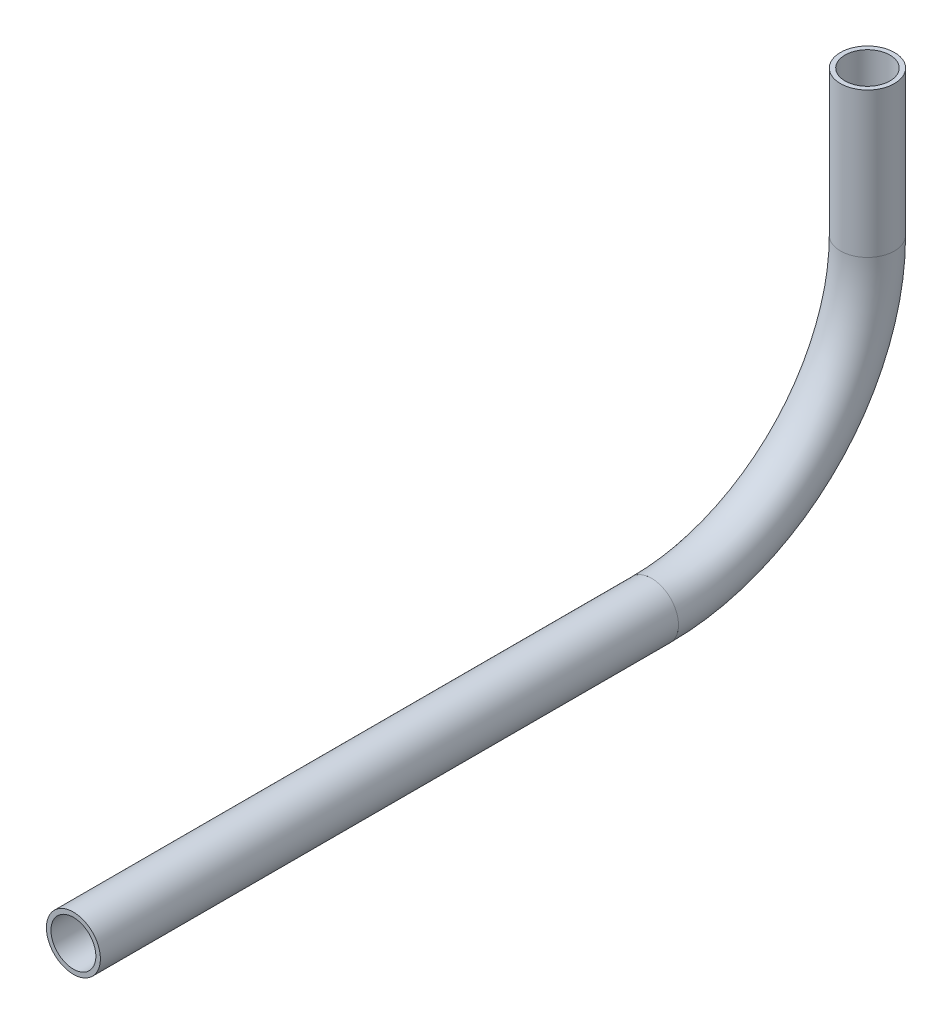
ISO-10303-21;
HEADER;
FILE_DESCRIPTION(('STEP AP214'),'2;1');
FILE_NAME('part.step','',(''),(''),'','','');
FILE_SCHEMA(('AUTOMOTIVE_DESIGN { 1 0 10303 214 1 1 1 1 }'));
ENDSEC;
DATA;
#1=APPLICATION_CONTEXT('core data for automotive mechanical design processes');
#2=APPLICATION_PROTOCOL_DEFINITION('international standard','automotive_design',2000,#1);
#3=PRODUCT_CONTEXT('',#1,'mechanical');
#4=PRODUCT('Part','Part','',(#3));
#5=PRODUCT_RELATED_PRODUCT_CATEGORY('part','',(#4));
#6=PRODUCT_DEFINITION_FORMATION('','',#4);
#7=PRODUCT_DEFINITION_CONTEXT('part definition',#1,'design');
#8=PRODUCT_DEFINITION('design','',#6,#7);
#9=PRODUCT_DEFINITION_SHAPE('','',#8);
#10=(LENGTH_UNIT() NAMED_UNIT(*) SI_UNIT(.MILLI.,.METRE.));
#11=(NAMED_UNIT(*) PLANE_ANGLE_UNIT() SI_UNIT($,.RADIAN.));
#12=(NAMED_UNIT(*) SI_UNIT($,.STERADIAN.) SOLID_ANGLE_UNIT());
#13=UNCERTAINTY_MEASURE_WITH_UNIT(LENGTH_MEASURE(1.E-05),#10,'distance_accuracy_value','');
#14=(GEOMETRIC_REPRESENTATION_CONTEXT(3) GLOBAL_UNCERTAINTY_ASSIGNED_CONTEXT((#13)) GLOBAL_UNIT_ASSIGNED_CONTEXT((#10,
#11,#12)) REPRESENTATION_CONTEXT('',''));
#15=CARTESIAN_POINT('',(0.,0.,0.));
#16=DIRECTION('',(0.,0.,1.));
#17=DIRECTION('',(1.,0.,0.));
#18=AXIS2_PLACEMENT_3D('',#15,#16,#17);
#19=CARTESIAN_POINT('',(0.,599.96001927236,167.15895807332));
#20=DIRECTION('',(0.,0.,1.));
#21=DIRECTION('',(1.,0.,0.));
#22=AXIS2_PLACEMENT_3D('',#19,#20,#21);
#23=CYLINDRICAL_SURFACE('',#22,5.28320000000004);
#24=CARTESIAN_POINT('',(0.,599.96001927236,303.16459571102));
#25=DIRECTION('',(0.,0.,-1.));
#26=DIRECTION('',(-1.,0.,0.));
#27=AXIS2_PLACEMENT_3D('',#24,#25,#26);
#28=CIRCLE('',#27,5.28320000000004);
#29=CARTESIAN_POINT('',(-5.28320000000004,599.96001927236,303.16459571102));
#30=VERTEX_POINT('',#29);
#31=EDGE_CURVE('E54',#30,#30,#28,.T.);
#32=ORIENTED_EDGE('',*,*,#31,.F.);
#33=EDGE_LOOP('',(#32));
#34=FACE_BOUND('',#33,.T.);
#35=CARTESIAN_POINT('',(0.,599.96001927236,167.15895807332));
#36=DIRECTION('',(0.,0.,-1.));
#37=DIRECTION('',(-1.,0.,0.));
#38=AXIS2_PLACEMENT_3D('',#35,#36,#37);
#39=CIRCLE('',#38,5.28320000000004);
#40=CARTESIAN_POINT('',(-5.28320000000004,599.96001927236,167.15895807332));
#41=VERTEX_POINT('',#40);
#42=EDGE_CURVE('E50',#41,#41,#39,.T.);
#43=ORIENTED_EDGE('',*,*,#42,.T.);
#44=EDGE_LOOP('',(#43));
#45=FACE_BOUND('',#44,.T.);
#46=ADVANCED_FACE('F46',(#34,#45),#23,.F.);
#47=CARTESIAN_POINT('',(0.,599.96001927236,167.15895807332));
#48=DIRECTION('',(0.,0.,1.));
#49=DIRECTION('',(1.,0.,0.));
#50=AXIS2_PLACEMENT_3D('',#47,#48,#49);
#51=CYLINDRICAL_SURFACE('',#50,6.35000000000005);
#52=CARTESIAN_POINT('',(0.,599.96001927236,303.16459571102));
#53=DIRECTION('',(0.,0.,-1.));
#54=DIRECTION('',(-1.,0.,0.));
#55=AXIS2_PLACEMENT_3D('',#52,#53,#54);
#56=CIRCLE('',#55,6.35000000000005);
#57=CARTESIAN_POINT('',(-6.35000000000005,599.96001927236,303.16459571102));
#58=VERTEX_POINT('',#57);
#59=EDGE_CURVE('E58',#58,#58,#56,.T.);
#60=ORIENTED_EDGE('',*,*,#59,.T.);
#61=EDGE_LOOP('',(#60));
#62=FACE_BOUND('',#61,.T.);
#63=CARTESIAN_POINT('',(0.,599.96001927236,167.15895807332));
#64=DIRECTION('',(0.,0.,-1.));
#65=DIRECTION('',(-1.,0.,0.));
#66=AXIS2_PLACEMENT_3D('',#63,#64,#65);
#67=CIRCLE('',#66,6.35000000000005);
#68=CARTESIAN_POINT('',(-6.35000000000005,599.96001927236,167.15895807332));
#69=VERTEX_POINT('',#68);
#70=EDGE_CURVE('E12',#69,#69,#67,.T.);
#71=ORIENTED_EDGE('',*,*,#70,.F.);
#72=EDGE_LOOP('',(#71));
#73=FACE_BOUND('',#72,.T.);
#74=ADVANCED_FACE('F73',(#62,#73),#51,.T.);
#75=CARTESIAN_POINT('',(0.,599.96001927236,303.16459571102));
#76=DIRECTION('',(0.,0.,-1.));
#77=DIRECTION('',(-1.,0.,0.));
#78=AXIS2_PLACEMENT_3D('',#75,#76,#77);
#79=PLANE('',#78);
#80=ORIENTED_EDGE('',*,*,#31,.T.);
#81=EDGE_LOOP('',(#80));
#82=FACE_BOUND('',#81,.T.);
#83=ORIENTED_EDGE('',*,*,#59,.F.);
#84=EDGE_LOOP('',(#83));
#85=FACE_BOUND('',#84,.T.);
#86=ADVANCED_FACE('F69',(#82,#85),#79,.F.);
#87=CARTESIAN_POINT('',(0.,599.96001927236,167.15895807332));
#88=DIRECTION('',(0.,0.,-1.));
#89=DIRECTION('',(-1.,0.,0.));
#90=AXIS2_PLACEMENT_3D('',#87,#88,#89);
#91=PLANE('',#90);
#92=ORIENTED_EDGE('',*,*,#42,.F.);
#93=EDGE_LOOP('',(#92));
#94=FACE_BOUND('',#93,.T.);
#95=ORIENTED_EDGE('',*,*,#70,.T.);
#96=EDGE_LOOP('',(#95));
#97=FACE_BOUND('',#96,.T.);
#98=ADVANCED_FACE('F48',(#94,#97),#91,.T.);
#99=CLOSED_SHELL('',(#46,#74,#86,#98));
#100=MANIFOLD_SOLID_BREP('B2',#99);
#101=CARTESIAN_POINT('',(0.,650.76001927236,167.15895807332));
#102=DIRECTION('',(-1.,0.,0.));
#103=DIRECTION('',(0.,0.,1.));
#104=AXIS2_PLACEMENT_3D('',#101,#102,#103);
#105=TOROIDAL_SURFACE('',#104,50.8,5.28320000000004);
#106=CARTESIAN_POINT('',(0.,650.76001927236,116.35895807332));
#107=DIRECTION('',(0.,1.,0.));
#108=DIRECTION('',(0.,0.,1.));
#109=AXIS2_PLACEMENT_3D('',#106,#107,#108);
#110=CIRCLE('',#109,5.28320000000004);
#111=CARTESIAN_POINT('',(0.,650.76001927236,111.07575807332));
#112=VERTEX_POINT('',#111);
#113=EDGE_CURVE('E149',#112,#112,#110,.T.);
#114=CARTESIAN_POINT('',(0.,599.96001927236,167.15895807332));
#115=DIRECTION('',(0.,0.,1.));
#116=DIRECTION('',(1.,0.,0.));
#117=AXIS2_PLACEMENT_3D('',#114,#115,#116);
#118=CIRCLE('',#117,5.28320000000004);
#119=CARTESIAN_POINT('',(0.,594.67681927236,167.15895807332));
#120=VERTEX_POINT('',#119);
#121=EDGE_CURVE('E139',#120,#120,#118,.T.);
#122=CARTESIAN_POINT('',(0.,650.76001927236,167.15895807332));
#123=DIRECTION('',(-1.,0.,0.));
#124=DIRECTION('',(0.,0.,1.));
#125=AXIS2_PLACEMENT_3D('',#122,#123,#124);
#126=CIRCLE('',#125,56.0832000000001);
#127=EDGE_CURVE('',#112,#120,#126,.T.);
#128=ORIENTED_EDGE('',*,*,#113,.T.);
#129=ORIENTED_EDGE('',*,*,#121,.T.);
#130=ORIENTED_EDGE('',*,*,#127,.T.);
#131=ORIENTED_EDGE('',*,*,#127,.F.);
#132=EDGE_LOOP('',(#128,#130,#129,#131));
#133=FACE_BOUND('',#132,.T.);
#134=ADVANCED_FACE('F135',(#133),#105,.F.);
#135=CARTESIAN_POINT('',(0.,650.76001927236,167.15895807332));
#136=DIRECTION('',(-1.,0.,0.));
#137=DIRECTION('',(0.,0.,1.));
#138=AXIS2_PLACEMENT_3D('',#135,#136,#137);
#139=TOROIDAL_SURFACE('',#138,50.8,6.35000000000005);
#140=CARTESIAN_POINT('',(0.,650.76001927236,116.35895807332));
#141=DIRECTION('',(0.,1.,0.));
#142=DIRECTION('',(0.,0.,1.));
#143=AXIS2_PLACEMENT_3D('',#140,#141,#142);
#144=CIRCLE('',#143,6.35000000000005);
#145=CARTESIAN_POINT('',(0.,650.76001927236,110.00895807332));
#146=VERTEX_POINT('',#145);
#147=EDGE_CURVE('E143',#146,#146,#144,.T.);
#148=CARTESIAN_POINT('',(0.,599.96001927236,167.15895807332));
#149=DIRECTION('',(0.,0.,1.));
#150=DIRECTION('',(1.,0.,0.));
#151=AXIS2_PLACEMENT_3D('',#148,#149,#150);
#152=CIRCLE('',#151,6.35000000000005);
#153=CARTESIAN_POINT('',(0.,593.61001927236,167.15895807332));
#154=VERTEX_POINT('',#153);
#155=EDGE_CURVE('E45',#154,#154,#152,.T.);
#156=CARTESIAN_POINT('',(0.,650.76001927236,167.15895807332));
#157=DIRECTION('',(-1.,0.,0.));
#158=DIRECTION('',(0.,0.,1.));
#159=AXIS2_PLACEMENT_3D('',#156,#157,#158);
#160=CIRCLE('',#159,57.1500000000001);
#161=EDGE_CURVE('',#146,#154,#160,.T.);
#162=ORIENTED_EDGE('',*,*,#147,.F.);
#163=ORIENTED_EDGE('',*,*,#155,.F.);
#164=ORIENTED_EDGE('',*,*,#161,.T.);
#165=ORIENTED_EDGE('',*,*,#161,.F.);
#166=EDGE_LOOP('',(#162,#164,#163,#165));
#167=FACE_BOUND('',#166,.T.);
#168=ADVANCED_FACE('F162',(#167),#139,.T.);
#169=CARTESIAN_POINT('',(0.,650.76001927236,116.35895807332));
#170=DIRECTION('',(0.,1.,0.));
#171=DIRECTION('',(0.,0.,1.));
#172=AXIS2_PLACEMENT_3D('',#169,#170,#171);
#173=PLANE('',#172);
#174=ORIENTED_EDGE('',*,*,#113,.F.);
#175=EDGE_LOOP('',(#174));
#176=FACE_BOUND('',#175,.T.);
#177=ORIENTED_EDGE('',*,*,#147,.T.);
#178=EDGE_LOOP('',(#177));
#179=FACE_BOUND('',#178,.T.);
#180=ADVANCED_FACE('F158',(#176,#179),#173,.T.);
#181=CARTESIAN_POINT('',(0.,599.96001927236,167.15895807332));
#182=DIRECTION('',(0.,0.,1.));
#183=DIRECTION('',(1.,0.,0.));
#184=AXIS2_PLACEMENT_3D('',#181,#182,#183);
#185=PLANE('',#184);
#186=ORIENTED_EDGE('',*,*,#121,.F.);
#187=EDGE_LOOP('',(#186));
#188=FACE_BOUND('',#187,.T.);
#189=ORIENTED_EDGE('',*,*,#155,.T.);
#190=EDGE_LOOP('',(#189));
#191=FACE_BOUND('',#190,.T.);
#192=ADVANCED_FACE('F137',(#188,#191),#185,.T.);
#193=CLOSED_SHELL('',(#134,#168,#180,#192));
#194=MANIFOLD_SOLID_BREP('B7',#193);
#195=CARTESIAN_POINT('',(0.,684.869031623386,116.35895807332));
#196=DIRECTION('',(0.,-1.,0.));
#197=DIRECTION('',(0.,0.,-1.));
#198=AXIS2_PLACEMENT_3D('',#195,#196,#197);
#199=CYLINDRICAL_SURFACE('',#198,5.28320000000004);
#200=CARTESIAN_POINT('',(0.,684.869031623386,116.35895807332));
#201=DIRECTION('',(0.,1.,0.));
#202=DIRECTION('',(-1.,0.,0.));
#203=AXIS2_PLACEMENT_3D('',#200,#201,#202);
#204=CIRCLE('',#203,5.28320000000004);
#205=CARTESIAN_POINT('',(-5.28320000000004,684.869031623386,116.35895807332));
#206=VERTEX_POINT('',#205);
#207=EDGE_CURVE('E233',#206,#206,#204,.T.);
#208=ORIENTED_EDGE('',*,*,#207,.T.);
#209=EDGE_LOOP('',(#208));
#210=FACE_BOUND('',#209,.T.);
#211=CARTESIAN_POINT('',(0.,650.76001927236,116.35895807332));
#212=DIRECTION('',(0.,-1.,0.));
#213=DIRECTION('',(0.,0.,-1.));
#214=AXIS2_PLACEMENT_3D('',#211,#212,#213);
#215=CIRCLE('',#214,5.28320000000004);
#216=CARTESIAN_POINT('',(0.,650.76001927236,111.07575807332));
#217=VERTEX_POINT('',#216);
#218=EDGE_CURVE('E223',#217,#217,#215,.T.);
#219=ORIENTED_EDGE('',*,*,#218,.T.);
#220=EDGE_LOOP('',(#219));
#221=FACE_BOUND('',#220,.T.);
#222=ADVANCED_FACE('F219',(#210,#221),#199,.F.);
#223=CARTESIAN_POINT('',(0.,684.869031623386,116.35895807332));
#224=DIRECTION('',(0.,-1.,0.));
#225=DIRECTION('',(0.,0.,-1.));
#226=AXIS2_PLACEMENT_3D('',#223,#224,#225);
#227=CYLINDRICAL_SURFACE('',#226,6.35000000000005);
#228=CARTESIAN_POINT('',(0.,684.869031623386,116.35895807332));
#229=DIRECTION('',(0.,1.,0.));
#230=DIRECTION('',(-1.,0.,0.));
#231=AXIS2_PLACEMENT_3D('',#228,#229,#230);
#232=CIRCLE('',#231,6.35000000000005);
#233=CARTESIAN_POINT('',(-6.35000000000005,684.869031623386,116.35895807332));
#234=VERTEX_POINT('',#233);
#235=EDGE_CURVE('E227',#234,#234,#232,.T.);
#236=ORIENTED_EDGE('',*,*,#235,.F.);
#237=EDGE_LOOP('',(#236));
#238=FACE_BOUND('',#237,.T.);
#239=CARTESIAN_POINT('',(0.,650.76001927236,116.35895807332));
#240=DIRECTION('',(0.,-1.,0.));
#241=DIRECTION('',(0.,0.,-1.));
#242=AXIS2_PLACEMENT_3D('',#239,#240,#241);
#243=CIRCLE('',#242,6.35000000000005);
#244=CARTESIAN_POINT('',(0.,650.76001927236,110.00895807332));
#245=VERTEX_POINT('',#244);
#246=EDGE_CURVE('E134',#245,#245,#243,.T.);
#247=ORIENTED_EDGE('',*,*,#246,.F.);
#248=EDGE_LOOP('',(#247));
#249=FACE_BOUND('',#248,.T.);
#250=ADVANCED_FACE('F246',(#238,#249),#227,.T.);
#251=CARTESIAN_POINT('',(0.,684.869031623386,116.35895807332));
#252=DIRECTION('',(0.,1.,0.));
#253=DIRECTION('',(-1.,0.,0.));
#254=AXIS2_PLACEMENT_3D('',#251,#252,#253);
#255=PLANE('',#254);
#256=ORIENTED_EDGE('',*,*,#207,.F.);
#257=EDGE_LOOP('',(#256));
#258=FACE_BOUND('',#257,.T.);
#259=ORIENTED_EDGE('',*,*,#235,.T.);
#260=EDGE_LOOP('',(#259));
#261=FACE_BOUND('',#260,.T.);
#262=ADVANCED_FACE('F242',(#258,#261),#255,.T.);
#263=CARTESIAN_POINT('',(0.,650.76001927236,116.35895807332));
#264=DIRECTION('',(0.,-1.,0.));
#265=DIRECTION('',(0.,0.,-1.));
#266=AXIS2_PLACEMENT_3D('',#263,#264,#265);
#267=PLANE('',#266);
#268=ORIENTED_EDGE('',*,*,#218,.F.);
#269=EDGE_LOOP('',(#268));
#270=FACE_BOUND('',#269,.T.);
#271=ORIENTED_EDGE('',*,*,#246,.T.);
#272=EDGE_LOOP('',(#271));
#273=FACE_BOUND('',#272,.T.);
#274=ADVANCED_FACE('F221',(#270,#273),#267,.T.);
#275=CLOSED_SHELL('',(#222,#250,#262,#274));
#276=MANIFOLD_SOLID_BREP('B40',#275);
#277=ADVANCED_BREP_SHAPE_REPRESENTATION('',(#18,#100,#194,#276),#14);
#278=SHAPE_DEFINITION_REPRESENTATION(#9,#277);
ENDSEC;
END-ISO-10303-21;
